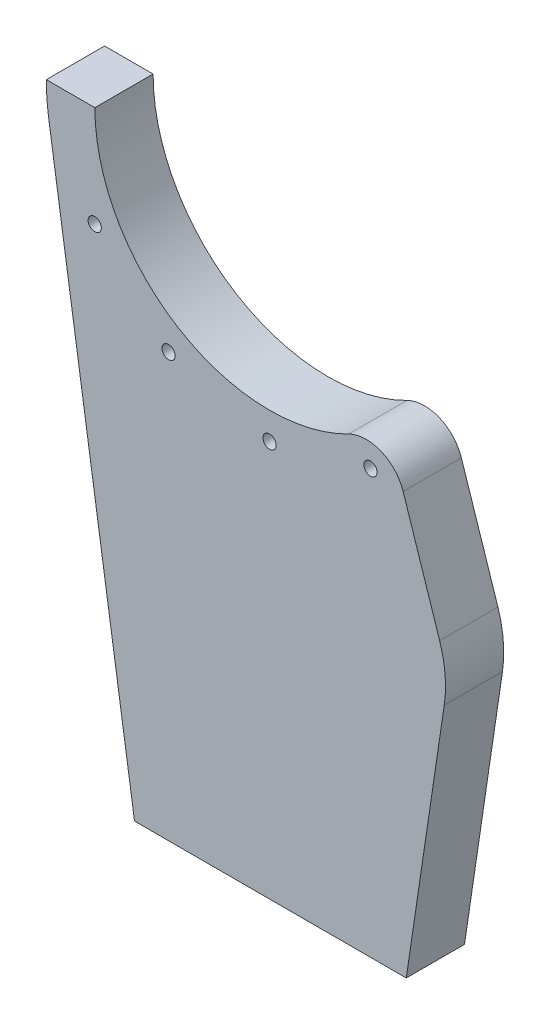
ISO-10303-21;
HEADER;
FILE_DESCRIPTION(('STEP AP214'),'2;1');
FILE_NAME('part.step','',(''),(''),'','','');
FILE_SCHEMA(('AUTOMOTIVE_DESIGN { 1 0 10303 214 1 1 1 1 }'));
ENDSEC;
DATA;
#1=APPLICATION_CONTEXT('core data for automotive mechanical design processes');
#2=APPLICATION_PROTOCOL_DEFINITION('international standard','automotive_design',2000,#1);
#3=PRODUCT_CONTEXT('',#1,'mechanical');
#4=PRODUCT('Part','Part','',(#3));
#5=PRODUCT_RELATED_PRODUCT_CATEGORY('part','',(#4));
#6=PRODUCT_DEFINITION_FORMATION('','',#4);
#7=PRODUCT_DEFINITION_CONTEXT('part definition',#1,'design');
#8=PRODUCT_DEFINITION('design','',#6,#7);
#9=PRODUCT_DEFINITION_SHAPE('','',#8);
#10=(LENGTH_UNIT() NAMED_UNIT(*) SI_UNIT(.MILLI.,.METRE.));
#11=(NAMED_UNIT(*) PLANE_ANGLE_UNIT() SI_UNIT($,.RADIAN.));
#12=(NAMED_UNIT(*) SI_UNIT($,.STERADIAN.) SOLID_ANGLE_UNIT());
#13=UNCERTAINTY_MEASURE_WITH_UNIT(LENGTH_MEASURE(1.E-05),#10,'distance_accuracy_value','');
#14=(GEOMETRIC_REPRESENTATION_CONTEXT(3) GLOBAL_UNCERTAINTY_ASSIGNED_CONTEXT((#13)) GLOBAL_UNIT_ASSIGNED_CONTEXT((#10,
#11,#12)) REPRESENTATION_CONTEXT('',''));
#15=CARTESIAN_POINT('',(0.,0.,0.));
#16=DIRECTION('',(0.,0.,1.));
#17=DIRECTION('',(1.,0.,0.));
#18=AXIS2_PLACEMENT_3D('',#15,#16,#17);
#19=CARTESIAN_POINT('',(0.,0.,15.));
#20=DIRECTION('',(0.,0.,-1.));
#21=DIRECTION('',(-1.,0.,0.));
#22=AXIS2_PLACEMENT_3D('',#19,#20,#21);
#23=CYLINDRICAL_SURFACE('',#22,45.);
#24=CARTESIAN_POINT('',(0.,0.,15.));
#25=DIRECTION('',(0.,0.,1.));
#26=DIRECTION('',(1.,0.,0.));
#27=AXIS2_PLACEMENT_3D('',#24,#25,#26);
#28=CIRCLE('',#27,45.);
#29=CARTESIAN_POINT('',(-45.,0.,15.));
#30=VERTEX_POINT('',#29);
#31=CARTESIAN_POINT('',(20.3798950037651,-40.1205667910551,15.));
#32=VERTEX_POINT('',#31);
#33=EDGE_CURVE('E107',#30,#32,#28,.T.);
#34=ORIENTED_EDGE('',*,*,#33,.T.);
#35=DIRECTION('',(0.,0.,-1.));
#36=VECTOR('',#35,1.);
#37=CARTESIAN_POINT('',(20.3798950037651,-40.1205667910551,15.));
#38=LINE('',#37,#36);
#39=CARTESIAN_POINT('',(20.3798950037651,-40.1205667910551,0.));
#40=VERTEX_POINT('',#39);
#41=EDGE_CURVE('E115',#32,#40,#38,.T.);
#42=ORIENTED_EDGE('',*,*,#41,.T.);
#43=CARTESIAN_POINT('',(0.,0.,0.));
#44=DIRECTION('',(0.,0.,1.));
#45=DIRECTION('',(1.,0.,0.));
#46=AXIS2_PLACEMENT_3D('',#43,#44,#45);
#47=CIRCLE('',#46,45.);
#48=CARTESIAN_POINT('',(-45.,0.,0.));
#49=VERTEX_POINT('',#48);
#50=EDGE_CURVE('E110',#49,#40,#47,.T.);
#51=ORIENTED_EDGE('',*,*,#50,.F.);
#52=DIRECTION('',(0.,0.,-1.));
#53=VECTOR('',#52,1.);
#54=CARTESIAN_POINT('',(-45.,0.,15.));
#55=LINE('',#54,#53);
#56=EDGE_CURVE('E104',#30,#49,#55,.T.);
#57=ORIENTED_EDGE('',*,*,#56,.F.);
#58=EDGE_LOOP('',(#34,#42,#51,#57));
#59=FACE_BOUND('',#58,.T.);
#60=ADVANCED_FACE('F35',(#59),#23,.F.);
#61=CARTESIAN_POINT('',(0.,0.,15.));
#62=DIRECTION('',(0.,1.,0.));
#63=DIRECTION('',(0.,0.,1.));
#64=AXIS2_PLACEMENT_3D('',#61,#62,#63);
#65=PLANE('',#64);
#66=DIRECTION('',(1.,0.,0.));
#67=VECTOR('',#66,1.);
#68=CARTESIAN_POINT('',(0.,0.,0.));
#69=LINE('',#68,#67);
#70=CARTESIAN_POINT('',(-57.5,0.,0.));
#71=VERTEX_POINT('',#70);
#72=EDGE_CURVE('E160',#71,#49,#69,.T.);
#73=ORIENTED_EDGE('',*,*,#72,.F.);
#74=DIRECTION('',(0.,0.,-1.));
#75=VECTOR('',#74,1.);
#76=CARTESIAN_POINT('',(-57.5,0.,15.));
#77=LINE('',#76,#75);
#78=CARTESIAN_POINT('',(-57.5,0.,15.));
#79=VERTEX_POINT('',#78);
#80=EDGE_CURVE('E116',#79,#71,#77,.T.);
#81=ORIENTED_EDGE('',*,*,#80,.F.);
#82=DIRECTION('',(1.,0.,0.));
#83=VECTOR('',#82,1.);
#84=CARTESIAN_POINT('',(0.,0.,15.));
#85=LINE('',#84,#83);
#86=EDGE_CURVE('E122',#79,#30,#85,.T.);
#87=ORIENTED_EDGE('',*,*,#86,.T.);
#88=ORIENTED_EDGE('',*,*,#56,.T.);
#89=EDGE_LOOP('',(#73,#81,#87,#88));
#90=FACE_BOUND('',#89,.T.);
#91=ADVANCED_FACE('F128',(#90),#65,.T.);
#92=CARTESIAN_POINT('',(0.,0.,15.));
#93=DIRECTION('',(0.,0.,-1.));
#94=DIRECTION('',(-1.,0.,0.));
#95=AXIS2_PLACEMENT_3D('',#92,#93,#94);
#96=CYLINDRICAL_SURFACE('',#95,57.5);
#97=CARTESIAN_POINT('',(0.,0.,0.));
#98=DIRECTION('',(0.,0.,1.));
#99=DIRECTION('',(1.,0.,0.));
#100=AXIS2_PLACEMENT_3D('',#97,#98,#99);
#101=CIRCLE('',#100,57.5);
#102=CARTESIAN_POINT('',(-56.8494448081949,-8.62499999999999,0.));
#103=VERTEX_POINT('',#102);
#104=EDGE_CURVE('E162',#71,#103,#101,.T.);
#105=ORIENTED_EDGE('',*,*,#104,.T.);
#106=DIRECTION('',(0.,0.,-1.));
#107=VECTOR('',#106,1.);
#108=CARTESIAN_POINT('',(-56.8494448081949,-8.62499999999999,15.));
#109=LINE('',#108,#107);
#110=CARTESIAN_POINT('',(-56.8494448081949,-8.62499999999999,15.));
#111=VERTEX_POINT('',#110);
#112=EDGE_CURVE('E181',#111,#103,#109,.T.);
#113=ORIENTED_EDGE('',*,*,#112,.F.);
#114=CARTESIAN_POINT('',(0.,0.,15.));
#115=DIRECTION('',(0.,0.,1.));
#116=DIRECTION('',(1.,0.,0.));
#117=AXIS2_PLACEMENT_3D('',#114,#115,#116);
#118=CIRCLE('',#117,57.5);
#119=EDGE_CURVE('E130',#79,#111,#118,.T.);
#120=ORIENTED_EDGE('',*,*,#119,.F.);
#121=ORIENTED_EDGE('',*,*,#80,.T.);
#122=EDGE_LOOP('',(#105,#113,#120,#121));
#123=FACE_BOUND('',#122,.T.);
#124=ADVANCED_FACE('F213',(#123),#96,.T.);
#125=CARTESIAN_POINT('',(-56.8494448081949,-8.625,15.));
#126=DIRECTION('',(0.988685996664259,0.15,0.));
#127=DIRECTION('',(-0.15,0.988685996664259,0.));
#128=AXIS2_PLACEMENT_3D('',#125,#126,#127);
#129=PLANE('',#128);
#130=DIRECTION('',(0.15,-0.98868599666426,0.));
#131=VECTOR('',#130,1.);
#132=CARTESIAN_POINT('',(-56.8494448081949,-8.625,0.));
#133=LINE('',#132,#131);
#134=CARTESIAN_POINT('',(-34.7864224142408,-154.047675233283,0.));
#135=VERTEX_POINT('',#134);
#136=EDGE_CURVE('E165',#103,#135,#133,.T.);
#137=ORIENTED_EDGE('',*,*,#136,.T.);
#138=DIRECTION('',(0.,0.,-1.));
#139=VECTOR('',#138,1.);
#140=CARTESIAN_POINT('',(-34.7864224142408,-154.047675233283,15.));
#141=LINE('',#140,#139);
#142=CARTESIAN_POINT('',(-34.7864224142408,-154.047675233283,15.));
#143=VERTEX_POINT('',#142);
#144=EDGE_CURVE('E178',#143,#135,#141,.T.);
#145=ORIENTED_EDGE('',*,*,#144,.F.);
#146=DIRECTION('',(0.15,-0.98868599666426,0.));
#147=VECTOR('',#146,1.);
#148=CARTESIAN_POINT('',(-56.8494448081949,-8.625,15.));
#149=LINE('',#148,#147);
#150=EDGE_CURVE('E132',#111,#143,#149,.T.);
#151=ORIENTED_EDGE('',*,*,#150,.F.);
#152=ORIENTED_EDGE('',*,*,#112,.T.);
#153=EDGE_LOOP('',(#137,#145,#151,#152));
#154=FACE_BOUND('',#153,.T.);
#155=ADVANCED_FACE('F264',(#154),#129,.F.);
#156=CARTESIAN_POINT('',(0.,-154.047675233283,15.));
#157=DIRECTION('',(0.,1.,0.));
#158=DIRECTION('',(0.,0.,1.));
#159=AXIS2_PLACEMENT_3D('',#156,#157,#158);
#160=PLANE('',#159);
#161=DIRECTION('',(1.,0.,0.));
#162=VECTOR('',#161,1.);
#163=CARTESIAN_POINT('',(0.,-154.047675233283,0.));
#164=LINE('',#163,#162);
#165=CARTESIAN_POINT('',(35.2135775857592,-154.047675233283,0.));
#166=VERTEX_POINT('',#165);
#167=EDGE_CURVE('E168',#135,#166,#164,.T.);
#168=ORIENTED_EDGE('',*,*,#167,.T.);
#169=DIRECTION('',(0.,0.,-1.));
#170=VECTOR('',#169,1.);
#171=CARTESIAN_POINT('',(35.2135775857592,-154.047675233283,15.));
#172=LINE('',#171,#170);
#173=CARTESIAN_POINT('',(35.2135775857592,-154.047675233283,15.));
#174=VERTEX_POINT('',#173);
#175=EDGE_CURVE('E146',#174,#166,#172,.T.);
#176=ORIENTED_EDGE('',*,*,#175,.F.);
#177=DIRECTION('',(1.,0.,0.));
#178=VECTOR('',#177,1.);
#179=CARTESIAN_POINT('',(0.,-154.047675233283,15.));
#180=LINE('',#179,#178);
#181=EDGE_CURVE('E138',#143,#174,#180,.T.);
#182=ORIENTED_EDGE('',*,*,#181,.F.);
#183=ORIENTED_EDGE('',*,*,#144,.T.);
#184=EDGE_LOOP('',(#168,#176,#182,#183));
#185=FACE_BOUND('',#184,.T.);
#186=ADVANCED_FACE('F261',(#185),#160,.F.);
#187=CARTESIAN_POINT('',(56.8739718143347,-8.46175691344687,15.));
#188=DIRECTION('',(0.989112553292777,-0.147160989799076,0.));
#189=DIRECTION('',(0.147160989799076,0.989112553292777,0.));
#190=AXIS2_PLACEMENT_3D('',#187,#188,#189);
#191=PLANE('',#190);
#192=DIRECTION('',(-0.147160989799076,-0.989112553292777,0.));
#193=VECTOR('',#192,1.);
#194=CARTESIAN_POINT('',(56.8739718143347,-8.46175691344687,0.));
#195=LINE('',#194,#193);
#196=CARTESIAN_POINT('',(44.9966905974099,-88.2924781303181,0.));
#197=VERTEX_POINT('',#196);
#198=EDGE_CURVE('E171',#197,#166,#195,.T.);
#199=ORIENTED_EDGE('',*,*,#198,.F.);
#200=DIRECTION('',(0.,0.,-1.));
#201=VECTOR('',#200,1.);
#202=CARTESIAN_POINT('',(44.9966905974099,-88.2924781303181,15.));
#203=LINE('',#202,#201);
#204=CARTESIAN_POINT('',(44.9966905974099,-88.2924781303181,15.));
#205=VERTEX_POINT('',#204);
#206=EDGE_CURVE('E43',#197,#205,#203,.F.);
#207=ORIENTED_EDGE('',*,*,#206,.T.);
#208=DIRECTION('',(-0.147160989799076,-0.989112553292777,0.));
#209=VECTOR('',#208,1.);
#210=CARTESIAN_POINT('',(56.8739718143347,-8.46175691344687,15.));
#211=LINE('',#210,#209);
#212=EDGE_CURVE('E141',#205,#174,#211,.T.);
#213=ORIENTED_EDGE('',*,*,#212,.T.);
#214=ORIENTED_EDGE('',*,*,#175,.T.);
#215=EDGE_LOOP('',(#199,#207,#213,#214));
#216=FACE_BOUND('',#215,.T.);
#217=ADVANCED_FACE('F221',(#216),#191,.T.);
#218=CARTESIAN_POINT('',(-1.81557029619843E-13,-52.,15.));
#219=DIRECTION('',(0.,0.,-1.));
#220=DIRECTION('',(-1.,0.,0.));
#221=AXIS2_PLACEMENT_3D('',#218,#219,#220);
#222=CYLINDRICAL_SURFACE('',#221,1.7);
#223=CARTESIAN_POINT('',(-1.81557029619843E-13,-52.,15.));
#224=DIRECTION('',(0.,0.,1.));
#225=DIRECTION('',(1.,0.,0.));
#226=AXIS2_PLACEMENT_3D('',#223,#224,#225);
#227=CIRCLE('',#226,1.7);
#228=CARTESIAN_POINT('',(1.69999999999982,-52.,15.));
#229=VERTEX_POINT('',#228);
#230=EDGE_CURVE('E126',#229,#229,#227,.T.);
#231=ORIENTED_EDGE('',*,*,#230,.T.);
#232=EDGE_LOOP('',(#231));
#233=FACE_BOUND('',#232,.T.);
#234=CARTESIAN_POINT('',(-1.81557029619843E-13,-52.,0.));
#235=DIRECTION('',(0.,0.,1.));
#236=DIRECTION('',(1.,0.,0.));
#237=AXIS2_PLACEMENT_3D('',#234,#235,#236);
#238=CIRCLE('',#237,1.7);
#239=CARTESIAN_POINT('',(1.69999999999982,-52.,0.));
#240=VERTEX_POINT('',#239);
#241=EDGE_CURVE('E156',#240,#240,#238,.T.);
#242=ORIENTED_EDGE('',*,*,#241,.F.);
#243=EDGE_LOOP('',(#242));
#244=FACE_BOUND('',#243,.T.);
#245=ADVANCED_FACE('F217',(#233,#244),#222,.F.);
#246=CARTESIAN_POINT('',(-26.0000000000002,-45.0333209967907,15.));
#247=DIRECTION('',(0.,0.,-1.));
#248=DIRECTION('',(-1.,0.,0.));
#249=AXIS2_PLACEMENT_3D('',#246,#247,#248);
#250=CYLINDRICAL_SURFACE('',#249,1.7);
#251=CARTESIAN_POINT('',(-26.0000000000002,-45.0333209967907,15.));
#252=DIRECTION('',(0.,0.,1.));
#253=DIRECTION('',(1.,0.,0.));
#254=AXIS2_PLACEMENT_3D('',#251,#252,#253);
#255=CIRCLE('',#254,1.7);
#256=CARTESIAN_POINT('',(-24.3000000000002,-45.0333209967907,15.));
#257=VERTEX_POINT('',#256);
#258=EDGE_CURVE('E364',#257,#257,#255,.T.);
#259=ORIENTED_EDGE('',*,*,#258,.T.);
#260=EDGE_LOOP('',(#259));
#261=FACE_BOUND('',#260,.T.);
#262=CARTESIAN_POINT('',(-26.0000000000002,-45.0333209967907,0.));
#263=DIRECTION('',(0.,0.,1.));
#264=DIRECTION('',(1.,0.,0.));
#265=AXIS2_PLACEMENT_3D('',#262,#263,#264);
#266=CIRCLE('',#265,1.7);
#267=CARTESIAN_POINT('',(-24.3000000000002,-45.0333209967907,0.));
#268=VERTEX_POINT('',#267);
#269=EDGE_CURVE('E153',#268,#268,#266,.T.);
#270=ORIENTED_EDGE('',*,*,#269,.F.);
#271=EDGE_LOOP('',(#270));
#272=FACE_BOUND('',#271,.T.);
#273=ADVANCED_FACE('F220',(#261,#272),#250,.F.);
#274=CARTESIAN_POINT('',(-45.033320996791,-25.9999999999997,15.));
#275=DIRECTION('',(0.,0.,-1.));
#276=DIRECTION('',(-1.,0.,0.));
#277=AXIS2_PLACEMENT_3D('',#274,#275,#276);
#278=CYLINDRICAL_SURFACE('',#277,1.69999999999999);
#279=CARTESIAN_POINT('',(-45.033320996791,-25.9999999999997,15.));
#280=DIRECTION('',(0.,0.,1.));
#281=DIRECTION('',(1.,0.,0.));
#282=AXIS2_PLACEMENT_3D('',#279,#280,#281);
#283=CIRCLE('',#282,1.69999999999999);
#284=CARTESIAN_POINT('',(-43.333320996791,-25.9999999999997,15.));
#285=VERTEX_POINT('',#284);
#286=EDGE_CURVE('E360',#285,#285,#283,.T.);
#287=ORIENTED_EDGE('',*,*,#286,.T.);
#288=EDGE_LOOP('',(#287));
#289=FACE_BOUND('',#288,.T.);
#290=CARTESIAN_POINT('',(-45.033320996791,-25.9999999999997,0.));
#291=DIRECTION('',(0.,0.,1.));
#292=DIRECTION('',(1.,0.,0.));
#293=AXIS2_PLACEMENT_3D('',#290,#291,#292);
#294=CIRCLE('',#293,1.69999999999999);
#295=CARTESIAN_POINT('',(-43.333320996791,-25.9999999999997,0.));
#296=VERTEX_POINT('',#295);
#297=EDGE_CURVE('E150',#296,#296,#294,.T.);
#298=ORIENTED_EDGE('',*,*,#297,.F.);
#299=EDGE_LOOP('',(#298));
#300=FACE_BOUND('',#299,.T.);
#301=ADVANCED_FACE('F225',(#289,#300),#278,.F.);
#302=CARTESIAN_POINT('',(25.9999999999993,-45.0333209967912,15.));
#303=DIRECTION('',(0.,0.,-1.));
#304=DIRECTION('',(-1.,0.,0.));
#305=AXIS2_PLACEMENT_3D('',#302,#303,#304);
#306=CYLINDRICAL_SURFACE('',#305,1.69999999999999);
#307=CARTESIAN_POINT('',(25.9999999999993,-45.0333209967912,15.));
#308=DIRECTION('',(0.,0.,1.));
#309=DIRECTION('',(1.,0.,0.));
#310=AXIS2_PLACEMENT_3D('',#307,#308,#309);
#311=CIRCLE('',#310,1.69999999999999);
#312=CARTESIAN_POINT('',(27.6999999999993,-45.0333209967912,15.));
#313=VERTEX_POINT('',#312);
#314=EDGE_CURVE('E175',#313,#313,#311,.T.);
#315=ORIENTED_EDGE('',*,*,#314,.T.);
#316=EDGE_LOOP('',(#315));
#317=FACE_BOUND('',#316,.T.);
#318=CARTESIAN_POINT('',(25.9999999999993,-45.0333209967912,0.));
#319=DIRECTION('',(0.,0.,1.));
#320=DIRECTION('',(1.,0.,0.));
#321=AXIS2_PLACEMENT_3D('',#318,#319,#320);
#322=CIRCLE('',#321,1.69999999999999);
#323=CARTESIAN_POINT('',(27.6999999999993,-45.0333209967912,0.));
#324=VERTEX_POINT('',#323);
#325=EDGE_CURVE('E147',#324,#324,#322,.T.);
#326=ORIENTED_EDGE('',*,*,#325,.F.);
#327=EDGE_LOOP('',(#326));
#328=FACE_BOUND('',#327,.T.);
#329=ADVANCED_FACE('F229',(#317,#328),#306,.F.);
#330=CARTESIAN_POINT('',(17.4063399147887,5.7305446898278,15.));
#331=DIRECTION('',(0.949848417268266,0.312710703707068,0.));
#332=DIRECTION('',(-0.312710703707068,0.949848417268266,0.));
#333=AXIS2_PLACEMENT_3D('',#330,#331,#332);
#334=PLANE('',#333);
#335=DIRECTION('',(0.312710703707068,-0.949848417268266,0.));
#336=VECTOR('',#335,1.);
#337=CARTESIAN_POINT('',(17.4063399147887,5.7305446898278,15.));
#338=LINE('',#337,#336);
#339=CARTESIAN_POINT('',(34.40724473284,-45.9091412631077,15.));
#340=VERTEX_POINT('',#339);
#341=CARTESIAN_POINT('',(43.8187665166745,-74.4963273251338,15.));
#342=VERTEX_POINT('',#341);
#343=EDGE_CURVE('E143',#340,#342,#338,.T.);
#344=ORIENTED_EDGE('',*,*,#343,.T.);
#345=DIRECTION('',(0.,0.,-1.));
#346=VECTOR('',#345,1.);
#347=CARTESIAN_POINT('',(43.8187665166745,-74.4963273251337,15.));
#348=LINE('',#347,#346);
#349=CARTESIAN_POINT('',(43.8187665166745,-74.4963273251338,0.));
#350=VERTEX_POINT('',#349);
#351=EDGE_CURVE('E191',#342,#350,#348,.T.);
#352=ORIENTED_EDGE('',*,*,#351,.T.);
#353=DIRECTION('',(0.312710703707068,-0.949848417268266,0.));
#354=VECTOR('',#353,1.);
#355=CARTESIAN_POINT('',(17.4063399147887,5.7305446898278,0.));
#356=LINE('',#355,#354);
#357=CARTESIAN_POINT('',(34.40724473284,-45.9091412631077,0.));
#358=VERTEX_POINT('',#357);
#359=EDGE_CURVE('E173',#358,#350,#356,.T.);
#360=ORIENTED_EDGE('',*,*,#359,.F.);
#361=DIRECTION('',(0.,0.,-1.));
#362=VECTOR('',#361,1.);
#363=CARTESIAN_POINT('',(34.40724473284,-45.9091412631077,15.));
#364=LINE('',#363,#362);
#365=EDGE_CURVE('E188',#358,#340,#364,.F.);
#366=ORIENTED_EDGE('',*,*,#365,.T.);
#367=EDGE_LOOP('',(#344,#352,#360,#366));
#368=FACE_BOUND('',#367,.T.);
#369=ADVANCED_FACE('F197',(#368),#334,.T.);
#370=CARTESIAN_POINT('',(0.,0.,15.));
#371=DIRECTION('',(0.,0.,1.));
#372=DIRECTION('',(1.,0.,0.));
#373=AXIS2_PLACEMENT_3D('',#370,#371,#372);
#374=PLANE('',#373);
#375=ORIENTED_EDGE('',*,*,#314,.F.);
#376=EDGE_LOOP('',(#375));
#377=FACE_BOUND('',#376,.T.);
#378=ORIENTED_EDGE('',*,*,#286,.F.);
#379=EDGE_LOOP('',(#378));
#380=FACE_BOUND('',#379,.T.);
#381=ORIENTED_EDGE('',*,*,#258,.F.);
#382=EDGE_LOOP('',(#381));
#383=FACE_BOUND('',#382,.T.);
#384=ORIENTED_EDGE('',*,*,#230,.F.);
#385=EDGE_LOOP('',(#384));
#386=FACE_BOUND('',#385,.T.);
#387=ORIENTED_EDGE('',*,*,#212,.F.);
#388=CARTESIAN_POINT('',(15.3233139986266,-83.8776484363458,15.));
#389=DIRECTION('',(0.,0.,1.));
#390=DIRECTION('',(1.,0.,0.));
#391=AXIS2_PLACEMENT_3D('',#388,#389,#390);
#392=CIRCLE('',#391,30.);
#393=EDGE_CURVE('E11',#205,#342,#392,.T.);
#394=ORIENTED_EDGE('',*,*,#393,.T.);
#395=ORIENTED_EDGE('',*,*,#343,.F.);
#396=CARTESIAN_POINT('',(24.9087605601573,-49.0362483001784,15.));
#397=DIRECTION('',(0.,0.,1.));
#398=DIRECTION('',(1.,0.,0.));
#399=AXIS2_PLACEMENT_3D('',#396,#397,#398);
#400=CIRCLE('',#399,10.);
#401=EDGE_CURVE('E125',#340,#32,#400,.T.);
#402=ORIENTED_EDGE('',*,*,#401,.T.);
#403=ORIENTED_EDGE('',*,*,#33,.F.);
#404=ORIENTED_EDGE('',*,*,#86,.F.);
#405=ORIENTED_EDGE('',*,*,#119,.T.);
#406=ORIENTED_EDGE('',*,*,#150,.T.);
#407=ORIENTED_EDGE('',*,*,#181,.T.);
#408=EDGE_LOOP('',(#387,#394,#395,#402,#403,#404,#405,#406,#407));
#409=FACE_BOUND('',#408,.T.);
#410=ADVANCED_FACE('F120',(#377,#380,#383,#386,#409),#374,.T.);
#411=CARTESIAN_POINT('',(0.,0.,0.));
#412=DIRECTION('',(0.,0.,1.));
#413=DIRECTION('',(1.,0.,0.));
#414=AXIS2_PLACEMENT_3D('',#411,#412,#413);
#415=PLANE('',#414);
#416=ORIENTED_EDGE('',*,*,#325,.T.);
#417=EDGE_LOOP('',(#416));
#418=FACE_BOUND('',#417,.T.);
#419=ORIENTED_EDGE('',*,*,#297,.T.);
#420=EDGE_LOOP('',(#419));
#421=FACE_BOUND('',#420,.T.);
#422=ORIENTED_EDGE('',*,*,#269,.T.);
#423=EDGE_LOOP('',(#422));
#424=FACE_BOUND('',#423,.T.);
#425=ORIENTED_EDGE('',*,*,#241,.T.);
#426=EDGE_LOOP('',(#425));
#427=FACE_BOUND('',#426,.T.);
#428=ORIENTED_EDGE('',*,*,#359,.T.);
#429=CARTESIAN_POINT('',(15.3233139986266,-83.8776484363458,0.));
#430=DIRECTION('',(0.,0.,1.));
#431=DIRECTION('',(1.,0.,0.));
#432=AXIS2_PLACEMENT_3D('',#429,#430,#431);
#433=CIRCLE('',#432,30.);
#434=EDGE_CURVE('E57',#350,#197,#433,.F.);
#435=ORIENTED_EDGE('',*,*,#434,.T.);
#436=ORIENTED_EDGE('',*,*,#198,.T.);
#437=ORIENTED_EDGE('',*,*,#167,.F.);
#438=ORIENTED_EDGE('',*,*,#136,.F.);
#439=ORIENTED_EDGE('',*,*,#104,.F.);
#440=ORIENTED_EDGE('',*,*,#72,.T.);
#441=ORIENTED_EDGE('',*,*,#50,.T.);
#442=CARTESIAN_POINT('',(24.9087605601573,-49.0362483001784,0.));
#443=DIRECTION('',(0.,0.,1.));
#444=DIRECTION('',(1.,0.,0.));
#445=AXIS2_PLACEMENT_3D('',#442,#443,#444);
#446=CIRCLE('',#445,10.);
#447=EDGE_CURVE('E186',#40,#358,#446,.F.);
#448=ORIENTED_EDGE('',*,*,#447,.T.);
#449=EDGE_LOOP('',(#428,#435,#436,#437,#438,#439,#440,#441,#448));
#450=FACE_BOUND('',#449,.T.);
#451=ADVANCED_FACE('F201',(#418,#421,#424,#427,#450),#415,.F.);
#452=CARTESIAN_POINT('',(24.9087605601573,-49.0362483001784,15.));
#453=DIRECTION('',(0.,0.,-1.));
#454=DIRECTION('',(-1.,0.,0.));
#455=AXIS2_PLACEMENT_3D('',#452,#453,#454);
#456=CYLINDRICAL_SURFACE('',#455,10.);
#457=ORIENTED_EDGE('',*,*,#401,.F.);
#458=ORIENTED_EDGE('',*,*,#365,.F.);
#459=ORIENTED_EDGE('',*,*,#447,.F.);
#460=ORIENTED_EDGE('',*,*,#41,.F.);
#461=EDGE_LOOP('',(#457,#458,#459,#460));
#462=FACE_BOUND('',#461,.T.);
#463=ADVANCED_FACE('F203',(#462),#456,.T.);
#464=CARTESIAN_POINT('',(15.3233139986266,-83.8776484363458,15.));
#465=DIRECTION('',(0.,0.,-1.));
#466=DIRECTION('',(-1.,0.,0.));
#467=AXIS2_PLACEMENT_3D('',#464,#465,#466);
#468=CYLINDRICAL_SURFACE('',#467,30.);
#469=ORIENTED_EDGE('',*,*,#393,.F.);
#470=ORIENTED_EDGE('',*,*,#206,.F.);
#471=ORIENTED_EDGE('',*,*,#434,.F.);
#472=ORIENTED_EDGE('',*,*,#351,.F.);
#473=EDGE_LOOP('',(#469,#470,#471,#472));
#474=FACE_BOUND('',#473,.T.);
#475=ADVANCED_FACE('F37',(#474),#468,.T.);
#476=CLOSED_SHELL('',(#60,#91,#124,#155,#186,#217,#245,#273,#301,#329,#369,#410,#451,#463,#475));
#477=MANIFOLD_SOLID_BREP('B2',#476);
#478=ADVANCED_BREP_SHAPE_REPRESENTATION('',(#18,#477),#14);
#479=SHAPE_DEFINITION_REPRESENTATION(#9,#478);
ENDSEC;
END-ISO-10303-21;
